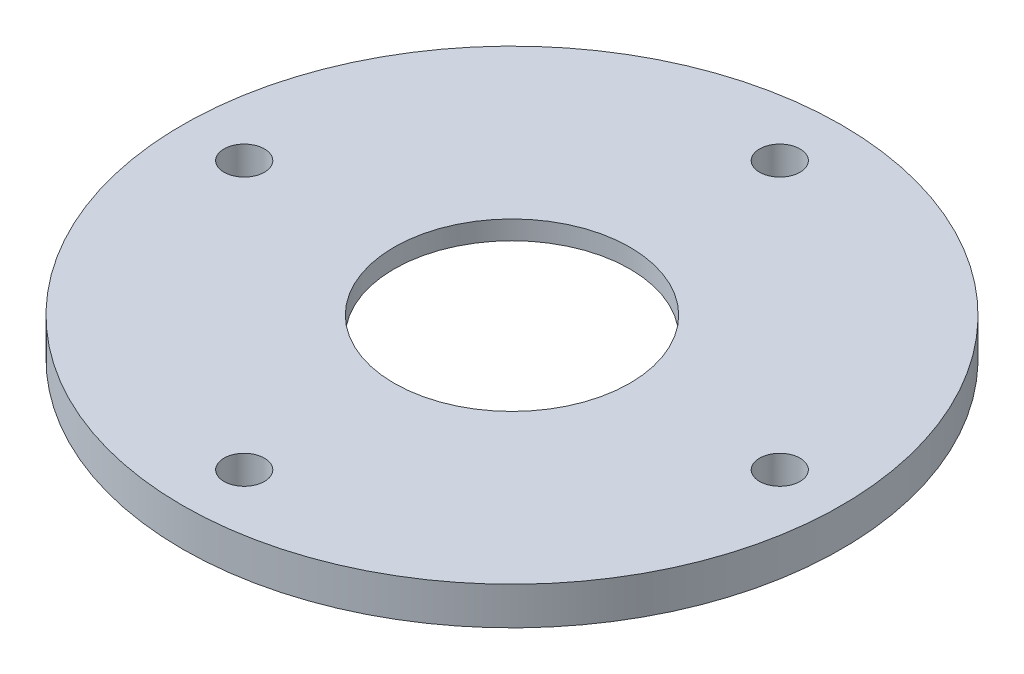
ISO-10303-21;
HEADER;
FILE_DESCRIPTION(('STEP AP214'),'2;1');
FILE_NAME('part.step','',(''),(''),'','','');
FILE_SCHEMA(('AUTOMOTIVE_DESIGN { 1 0 10303 214 1 1 1 1 }'));
ENDSEC;
DATA;
#1=APPLICATION_CONTEXT('core data for automotive mechanical design processes');
#2=APPLICATION_PROTOCOL_DEFINITION('international standard','automotive_design',2000,#1);
#3=PRODUCT_CONTEXT('',#1,'mechanical');
#4=PRODUCT('Part','Part','',(#3));
#5=PRODUCT_RELATED_PRODUCT_CATEGORY('part','',(#4));
#6=PRODUCT_DEFINITION_FORMATION('','',#4);
#7=PRODUCT_DEFINITION_CONTEXT('part definition',#1,'design');
#8=PRODUCT_DEFINITION('design','',#6,#7);
#9=PRODUCT_DEFINITION_SHAPE('','',#8);
#10=(LENGTH_UNIT() NAMED_UNIT(*) SI_UNIT(.MILLI.,.METRE.));
#11=(NAMED_UNIT(*) PLANE_ANGLE_UNIT() SI_UNIT($,.RADIAN.));
#12=(NAMED_UNIT(*) SI_UNIT($,.STERADIAN.) SOLID_ANGLE_UNIT());
#13=UNCERTAINTY_MEASURE_WITH_UNIT(LENGTH_MEASURE(1.E-05),#10,'distance_accuracy_value','');
#14=(GEOMETRIC_REPRESENTATION_CONTEXT(3) GLOBAL_UNCERTAINTY_ASSIGNED_CONTEXT((#13)) GLOBAL_UNIT_ASSIGNED_CONTEXT((#10,
#11,#12)) REPRESENTATION_CONTEXT('',''));
#15=CARTESIAN_POINT('',(0.,0.,0.));
#16=DIRECTION('',(0.,0.,1.));
#17=DIRECTION('',(1.,0.,0.));
#18=AXIS2_PLACEMENT_3D('',#15,#16,#17);
#19=CARTESIAN_POINT('',(27.69,0.,0.));
#20=DIRECTION('',(0.,-1.,0.));
#21=DIRECTION('',(0.,0.,-1.));
#22=AXIS2_PLACEMENT_3D('',#19,#20,#21);
#23=PLANE('',#22);
#24=CARTESIAN_POINT('',(0.,0.,-22.5));
#25=DIRECTION('',(0.,-1.,0.));
#26=DIRECTION('',(0.,0.,-1.));
#27=AXIS2_PLACEMENT_3D('',#24,#25,#26);
#28=CIRCLE('',#27,1.7);
#29=CARTESIAN_POINT('',(0.,0.,-24.2));
#30=VERTEX_POINT('',#29);
#31=EDGE_CURVE('E87',#30,#30,#28,.T.);
#32=ORIENTED_EDGE('',*,*,#31,.F.);
#33=EDGE_LOOP('',(#32));
#34=FACE_BOUND('',#33,.T.);
#35=CARTESIAN_POINT('',(-22.5,0.,0.));
#36=DIRECTION('',(0.,-1.,0.));
#37=DIRECTION('',(0.,0.,-1.));
#38=AXIS2_PLACEMENT_3D('',#35,#36,#37);
#39=CIRCLE('',#38,1.7);
#40=CARTESIAN_POINT('',(-22.5,0.,-1.7));
#41=VERTEX_POINT('',#40);
#42=EDGE_CURVE('E81',#41,#41,#39,.T.);
#43=ORIENTED_EDGE('',*,*,#42,.F.);
#44=EDGE_LOOP('',(#43));
#45=FACE_BOUND('',#44,.T.);
#46=CARTESIAN_POINT('',(0.,0.,22.5));
#47=DIRECTION('',(0.,-1.,0.));
#48=DIRECTION('',(0.,0.,-1.));
#49=AXIS2_PLACEMENT_3D('',#46,#47,#48);
#50=CIRCLE('',#49,1.7);
#51=CARTESIAN_POINT('',(0.,0.,20.8));
#52=VERTEX_POINT('',#51);
#53=EDGE_CURVE('E75',#52,#52,#50,.T.);
#54=ORIENTED_EDGE('',*,*,#53,.F.);
#55=EDGE_LOOP('',(#54));
#56=FACE_BOUND('',#55,.T.);
#57=CARTESIAN_POINT('',(22.5,0.,0.));
#58=DIRECTION('',(0.,-1.,0.));
#59=DIRECTION('',(0.,0.,-1.));
#60=AXIS2_PLACEMENT_3D('',#57,#58,#59);
#61=CIRCLE('',#60,1.7);
#62=CARTESIAN_POINT('',(22.5,0.,-1.7));
#63=VERTEX_POINT('',#62);
#64=EDGE_CURVE('E69',#63,#63,#61,.T.);
#65=ORIENTED_EDGE('',*,*,#64,.F.);
#66=EDGE_LOOP('',(#65));
#67=FACE_BOUND('',#66,.T.);
#68=CARTESIAN_POINT('',(0.,0.,0.));
#69=DIRECTION('',(0.,-1.,0.));
#70=DIRECTION('',(0.,0.,-1.));
#71=AXIS2_PLACEMENT_3D('',#68,#69,#70);
#72=CIRCLE('',#71,27.69);
#73=CARTESIAN_POINT('',(0.,0.,-27.69));
#74=VERTEX_POINT('',#73);
#75=EDGE_CURVE('E66',#74,#74,#72,.T.);
#76=ORIENTED_EDGE('',*,*,#75,.T.);
#77=EDGE_LOOP('',(#76));
#78=FACE_BOUND('',#77,.T.);
#79=CARTESIAN_POINT('',(0.,0.,0.));
#80=DIRECTION('',(0.,-1.,0.));
#81=DIRECTION('',(0.,0.,-1.));
#82=AXIS2_PLACEMENT_3D('',#79,#80,#81);
#83=CIRCLE('',#82,12.3063);
#84=CARTESIAN_POINT('',(0.,0.,-12.3063));
#85=VERTEX_POINT('',#84);
#86=EDGE_CURVE('E10',#85,#85,#83,.T.);
#87=ORIENTED_EDGE('',*,*,#86,.F.);
#88=EDGE_LOOP('',(#87));
#89=FACE_BOUND('',#88,.T.);
#90=ADVANCED_FACE('F43',(#34,#45,#56,#67,#78,#89),#23,.T.);
#91=CARTESIAN_POINT('',(0.,0.,0.));
#92=DIRECTION('',(0.,-1.,0.));
#93=DIRECTION('',(0.,0.,-1.));
#94=AXIS2_PLACEMENT_3D('',#91,#92,#93);
#95=CYLINDRICAL_SURFACE('',#94,12.3063);
#96=ORIENTED_EDGE('',*,*,#86,.T.);
#97=EDGE_LOOP('',(#96));
#98=FACE_BOUND('',#97,.T.);
#99=CARTESIAN_POINT('',(0.,1.58749999999999,0.));
#100=DIRECTION('',(0.,-1.,0.));
#101=DIRECTION('',(0.,0.,-1.));
#102=AXIS2_PLACEMENT_3D('',#99,#100,#101);
#103=CIRCLE('',#102,12.3063);
#104=CARTESIAN_POINT('',(0.,1.58749999999999,-12.3063));
#105=VERTEX_POINT('',#104);
#106=EDGE_CURVE('E49',#105,#105,#103,.T.);
#107=ORIENTED_EDGE('',*,*,#106,.F.);
#108=EDGE_LOOP('',(#107));
#109=FACE_BOUND('',#108,.T.);
#110=ADVANCED_FACE('F121',(#98,#109),#95,.F.);
#111=CARTESIAN_POINT('',(12.3063,1.58749999999999,0.));
#112=DIRECTION('',(0.,-1.,0.));
#113=DIRECTION('',(0.,0.,-1.));
#114=AXIS2_PLACEMENT_3D('',#111,#112,#113);
#115=PLANE('',#114);
#116=ORIENTED_EDGE('',*,*,#106,.T.);
#117=EDGE_LOOP('',(#116));
#118=FACE_BOUND('',#117,.T.);
#119=CARTESIAN_POINT('',(0.,1.58749999999999,0.));
#120=DIRECTION('',(0.,-1.,0.));
#121=DIRECTION('',(0.,0.,-1.));
#122=AXIS2_PLACEMENT_3D('',#119,#120,#121);
#123=CIRCLE('',#122,9.906);
#124=CARTESIAN_POINT('',(0.,1.58749999999999,-9.906));
#125=VERTEX_POINT('',#124);
#126=EDGE_CURVE('E53',#125,#125,#123,.T.);
#127=ORIENTED_EDGE('',*,*,#126,.F.);
#128=EDGE_LOOP('',(#127));
#129=FACE_BOUND('',#128,.T.);
#130=ADVANCED_FACE('F127',(#118,#129),#115,.T.);
#131=CARTESIAN_POINT('',(0.,0.,0.));
#132=DIRECTION('',(0.,-1.,0.));
#133=DIRECTION('',(0.,0.,-1.));
#134=AXIS2_PLACEMENT_3D('',#131,#132,#133);
#135=CYLINDRICAL_SURFACE('',#134,9.906);
#136=ORIENTED_EDGE('',*,*,#126,.T.);
#137=EDGE_LOOP('',(#136));
#138=FACE_BOUND('',#137,.T.);
#139=CARTESIAN_POINT('',(0.,3.175,0.));
#140=DIRECTION('',(0.,-1.,0.));
#141=DIRECTION('',(0.,0.,-1.));
#142=AXIS2_PLACEMENT_3D('',#139,#140,#141);
#143=CIRCLE('',#142,9.906);
#144=CARTESIAN_POINT('',(0.,3.175,-9.906));
#145=VERTEX_POINT('',#144);
#146=EDGE_CURVE('E57',#145,#145,#143,.T.);
#147=ORIENTED_EDGE('',*,*,#146,.F.);
#148=EDGE_LOOP('',(#147));
#149=FACE_BOUND('',#148,.T.);
#150=ADVANCED_FACE('F101',(#138,#149),#135,.F.);
#151=CARTESIAN_POINT('',(9.906,3.175,0.));
#152=DIRECTION('',(0.,1.,0.));
#153=DIRECTION('',(0.,0.,1.));
#154=AXIS2_PLACEMENT_3D('',#151,#152,#153);
#155=PLANE('',#154);
#156=CARTESIAN_POINT('',(0.,3.175,-22.5));
#157=DIRECTION('',(0.,1.,0.));
#158=DIRECTION('',(0.,0.,1.));
#159=AXIS2_PLACEMENT_3D('',#156,#157,#158);
#160=CIRCLE('',#159,1.7);
#161=CARTESIAN_POINT('',(0.,3.175,-20.8));
#162=VERTEX_POINT('',#161);
#163=EDGE_CURVE('E90',#162,#162,#160,.T.);
#164=ORIENTED_EDGE('',*,*,#163,.F.);
#165=EDGE_LOOP('',(#164));
#166=FACE_BOUND('',#165,.T.);
#167=CARTESIAN_POINT('',(-22.5,3.175,0.));
#168=DIRECTION('',(0.,1.,0.));
#169=DIRECTION('',(0.,0.,1.));
#170=AXIS2_PLACEMENT_3D('',#167,#168,#169);
#171=CIRCLE('',#170,1.7);
#172=CARTESIAN_POINT('',(-22.5,3.175,1.7));
#173=VERTEX_POINT('',#172);
#174=EDGE_CURVE('E84',#173,#173,#171,.T.);
#175=ORIENTED_EDGE('',*,*,#174,.F.);
#176=EDGE_LOOP('',(#175));
#177=FACE_BOUND('',#176,.T.);
#178=CARTESIAN_POINT('',(0.,3.175,22.5));
#179=DIRECTION('',(0.,1.,0.));
#180=DIRECTION('',(0.,0.,1.));
#181=AXIS2_PLACEMENT_3D('',#178,#179,#180);
#182=CIRCLE('',#181,1.7);
#183=CARTESIAN_POINT('',(0.,3.175,24.2));
#184=VERTEX_POINT('',#183);
#185=EDGE_CURVE('E78',#184,#184,#182,.T.);
#186=ORIENTED_EDGE('',*,*,#185,.F.);
#187=EDGE_LOOP('',(#186));
#188=FACE_BOUND('',#187,.T.);
#189=CARTESIAN_POINT('',(22.5,3.175,0.));
#190=DIRECTION('',(0.,1.,0.));
#191=DIRECTION('',(0.,0.,1.));
#192=AXIS2_PLACEMENT_3D('',#189,#190,#191);
#193=CIRCLE('',#192,1.7);
#194=CARTESIAN_POINT('',(22.5,3.175,1.7));
#195=VERTEX_POINT('',#194);
#196=EDGE_CURVE('E72',#195,#195,#193,.T.);
#197=ORIENTED_EDGE('',*,*,#196,.F.);
#198=EDGE_LOOP('',(#197));
#199=FACE_BOUND('',#198,.T.);
#200=ORIENTED_EDGE('',*,*,#146,.T.);
#201=EDGE_LOOP('',(#200));
#202=FACE_BOUND('',#201,.T.);
#203=CARTESIAN_POINT('',(0.,3.175,0.));
#204=DIRECTION('',(0.,-1.,0.));
#205=DIRECTION('',(0.,0.,-1.));
#206=AXIS2_PLACEMENT_3D('',#203,#204,#205);
#207=CIRCLE('',#206,27.69);
#208=CARTESIAN_POINT('',(0.,3.175,-27.69));
#209=VERTEX_POINT('',#208);
#210=EDGE_CURVE('E62',#209,#209,#207,.T.);
#211=ORIENTED_EDGE('',*,*,#210,.F.);
#212=EDGE_LOOP('',(#211));
#213=FACE_BOUND('',#212,.T.);
#214=ADVANCED_FACE('F97',(#166,#177,#188,#199,#202,#213),#155,.T.);
#215=CARTESIAN_POINT('',(0.,0.,0.));
#216=DIRECTION('',(0.,-1.,0.));
#217=DIRECTION('',(0.,0.,-1.));
#218=AXIS2_PLACEMENT_3D('',#215,#216,#217);
#219=CYLINDRICAL_SURFACE('',#218,27.69);
#220=ORIENTED_EDGE('',*,*,#210,.T.);
#221=EDGE_LOOP('',(#220));
#222=FACE_BOUND('',#221,.T.);
#223=ORIENTED_EDGE('',*,*,#75,.F.);
#224=EDGE_LOOP('',(#223));
#225=FACE_BOUND('',#224,.T.);
#226=ADVANCED_FACE('F100',(#222,#225),#219,.T.);
#227=CARTESIAN_POINT('',(22.5,3.175,0.));
#228=DIRECTION('',(0.,1.,0.));
#229=DIRECTION('',(0.,0.,1.));
#230=AXIS2_PLACEMENT_3D('',#227,#228,#229);
#231=CYLINDRICAL_SURFACE('',#230,1.7);
#232=ORIENTED_EDGE('',*,*,#196,.T.);
#233=EDGE_LOOP('',(#232));
#234=FACE_BOUND('',#233,.T.);
#235=ORIENTED_EDGE('',*,*,#64,.T.);
#236=EDGE_LOOP('',(#235));
#237=FACE_BOUND('',#236,.T.);
#238=ADVANCED_FACE('F115',(#234,#237),#231,.F.);
#239=CARTESIAN_POINT('',(0.,3.175,22.5));
#240=DIRECTION('',(0.,1.,0.));
#241=DIRECTION('',(0.,0.,1.));
#242=AXIS2_PLACEMENT_3D('',#239,#240,#241);
#243=CYLINDRICAL_SURFACE('',#242,1.7);
#244=ORIENTED_EDGE('',*,*,#185,.T.);
#245=EDGE_LOOP('',(#244));
#246=FACE_BOUND('',#245,.T.);
#247=ORIENTED_EDGE('',*,*,#53,.T.);
#248=EDGE_LOOP('',(#247));
#249=FACE_BOUND('',#248,.T.);
#250=ADVANCED_FACE('F137',(#246,#249),#243,.F.);
#251=CARTESIAN_POINT('',(-22.5,3.175,0.));
#252=DIRECTION('',(0.,1.,0.));
#253=DIRECTION('',(0.,0.,1.));
#254=AXIS2_PLACEMENT_3D('',#251,#252,#253);
#255=CYLINDRICAL_SURFACE('',#254,1.7);
#256=ORIENTED_EDGE('',*,*,#174,.T.);
#257=EDGE_LOOP('',(#256));
#258=FACE_BOUND('',#257,.T.);
#259=ORIENTED_EDGE('',*,*,#42,.T.);
#260=EDGE_LOOP('',(#259));
#261=FACE_BOUND('',#260,.T.);
#262=ADVANCED_FACE('F143',(#258,#261),#255,.F.);
#263=CARTESIAN_POINT('',(0.,3.175,-22.5));
#264=DIRECTION('',(0.,1.,0.));
#265=DIRECTION('',(0.,0.,1.));
#266=AXIS2_PLACEMENT_3D('',#263,#264,#265);
#267=CYLINDRICAL_SURFACE('',#266,1.7);
#268=ORIENTED_EDGE('',*,*,#163,.T.);
#269=EDGE_LOOP('',(#268));
#270=FACE_BOUND('',#269,.T.);
#271=ORIENTED_EDGE('',*,*,#31,.T.);
#272=EDGE_LOOP('',(#271));
#273=FACE_BOUND('',#272,.T.);
#274=ADVANCED_FACE('F94',(#270,#273),#267,.F.);
#275=CLOSED_SHELL('',(#90,#110,#130,#150,#214,#226,#238,#250,#262,#274));
#276=MANIFOLD_SOLID_BREP('B2',#275);
#277=ADVANCED_BREP_SHAPE_REPRESENTATION('',(#18,#276),#14);
#278=SHAPE_DEFINITION_REPRESENTATION(#9,#277);
ENDSEC;
END-ISO-10303-21;
